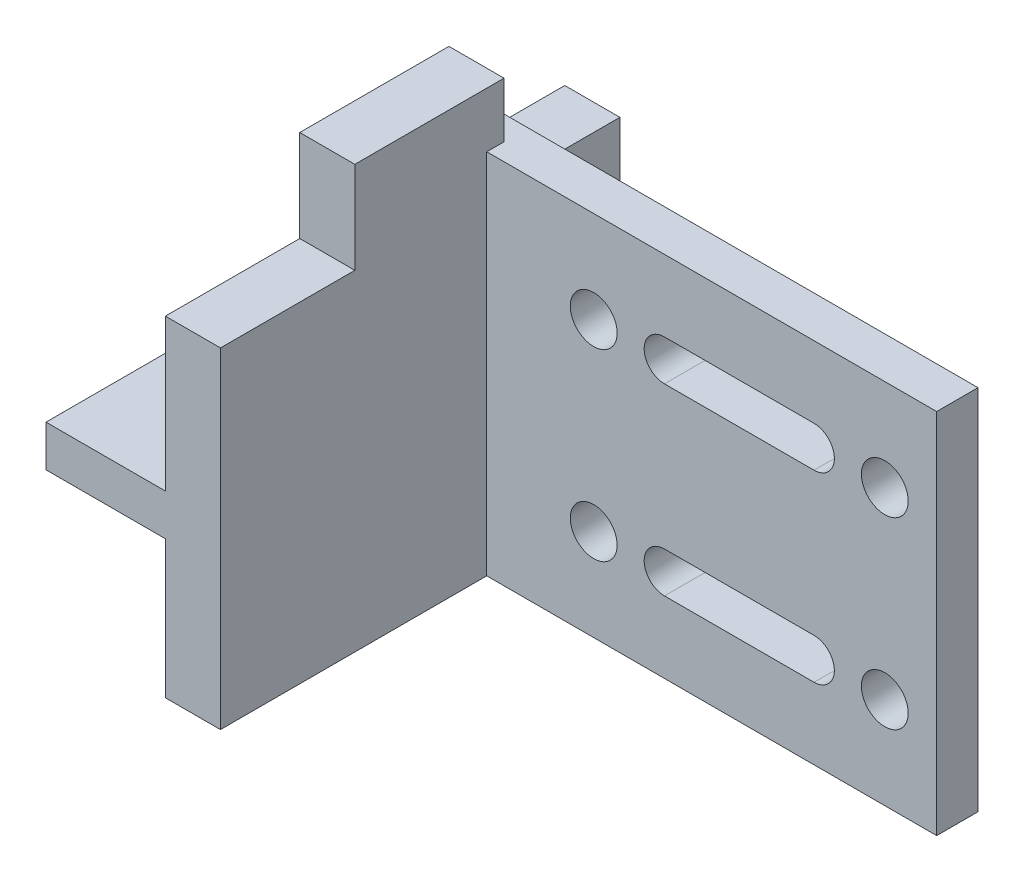
ISO-10303-21;
HEADER;
FILE_DESCRIPTION(('STEP AP214'),'2;1');
FILE_NAME('part.step','',(''),(''),'','','');
FILE_SCHEMA(('AUTOMOTIVE_DESIGN { 1 0 10303 214 1 1 1 1 }'));
ENDSEC;
DATA;
#1=APPLICATION_CONTEXT('core data for automotive mechanical design processes');
#2=APPLICATION_PROTOCOL_DEFINITION('international standard','automotive_design',2000,#1);
#3=PRODUCT_CONTEXT('',#1,'mechanical');
#4=PRODUCT('Part','Part','',(#3));
#5=PRODUCT_RELATED_PRODUCT_CATEGORY('part','',(#4));
#6=PRODUCT_DEFINITION_FORMATION('','',#4);
#7=PRODUCT_DEFINITION_CONTEXT('part definition',#1,'design');
#8=PRODUCT_DEFINITION('design','',#6,#7);
#9=PRODUCT_DEFINITION_SHAPE('','',#8);
#10=(LENGTH_UNIT() NAMED_UNIT(*) SI_UNIT(.MILLI.,.METRE.));
#11=(NAMED_UNIT(*) PLANE_ANGLE_UNIT() SI_UNIT($,.RADIAN.));
#12=(NAMED_UNIT(*) SI_UNIT($,.STERADIAN.) SOLID_ANGLE_UNIT());
#13=UNCERTAINTY_MEASURE_WITH_UNIT(LENGTH_MEASURE(1.E-05),#10,'distance_accuracy_value','');
#14=(GEOMETRIC_REPRESENTATION_CONTEXT(3) GLOBAL_UNCERTAINTY_ASSIGNED_CONTEXT((#13)) GLOBAL_UNIT_ASSIGNED_CONTEXT((#10,
#11,#12)) REPRESENTATION_CONTEXT('',''));
#15=CARTESIAN_POINT('',(0.,0.,0.));
#16=DIRECTION('',(0.,0.,1.));
#17=DIRECTION('',(1.,0.,0.));
#18=AXIS2_PLACEMENT_3D('',#15,#16,#17);
#19=CARTESIAN_POINT('',(-33.5,10.,4.5));
#20=DIRECTION('',(1.,0.,0.));
#21=DIRECTION('',(0.,0.,-1.));
#22=AXIS2_PLACEMENT_3D('',#19,#20,#21);
#23=PLANE('',#22);
#24=DIRECTION('',(0.,1.,0.));
#25=VECTOR('',#24,1.);
#26=CARTESIAN_POINT('',(-33.5,10.,-10.));
#27=LINE('',#26,#25);
#28=CARTESIAN_POINT('',(-33.5,9.5,-10.));
#29=VERTEX_POINT('',#28);
#30=CARTESIAN_POINT('',(-33.5,26.,-10.));
#31=VERTEX_POINT('',#30);
#32=EDGE_CURVE('E447',#29,#31,#27,.T.);
#33=ORIENTED_EDGE('',*,*,#32,.F.);
#34=DIRECTION('',(0.,0.,-1.));
#35=VECTOR('',#34,1.);
#36=CARTESIAN_POINT('',(-33.5,9.5,33.5));
#37=LINE('',#36,#35);
#38=CARTESIAN_POINT('',(-33.5,9.5,33.5));
#39=VERTEX_POINT('',#38);
#40=EDGE_CURVE('E458',#39,#29,#37,.T.);
#41=ORIENTED_EDGE('',*,*,#40,.F.);
#42=DIRECTION('',(0.,-1.,0.));
#43=VECTOR('',#42,1.);
#44=CARTESIAN_POINT('',(-33.5,10.,33.5));
#45=LINE('',#44,#43);
#46=CARTESIAN_POINT('',(-33.5,26.,33.5));
#47=VERTEX_POINT('',#46);
#48=EDGE_CURVE('E243',#47,#39,#45,.T.);
#49=ORIENTED_EDGE('',*,*,#48,.F.);
#50=DIRECTION('',(0.,0.,1.));
#51=VECTOR('',#50,1.);
#52=CARTESIAN_POINT('',(-33.5,26.,-10.));
#53=LINE('',#52,#51);
#54=CARTESIAN_POINT('',(-33.5,26.,18.8661616161615));
#55=VERTEX_POINT('',#54);
#56=EDGE_CURVE('E433',#55,#47,#53,.T.);
#57=ORIENTED_EDGE('',*,*,#56,.F.);
#58=DIRECTION('',(0.,-1.,0.));
#59=VECTOR('',#58,1.);
#60=CARTESIAN_POINT('',(-33.5,36.,18.8661616161615));
#61=LINE('',#60,#59);
#62=CARTESIAN_POINT('',(-33.5,36.,18.8661616161615));
#63=VERTEX_POINT('',#62);
#64=EDGE_CURVE('E427',#63,#55,#61,.T.);
#65=ORIENTED_EDGE('',*,*,#64,.F.);
#66=DIRECTION('',(0.,0.,1.));
#67=VECTOR('',#66,1.);
#68=CARTESIAN_POINT('',(-33.5,36.,2.61816440264701));
#69=LINE('',#68,#67);
#70=CARTESIAN_POINT('',(-33.5,36.,2.61816440264701));
#71=VERTEX_POINT('',#70);
#72=EDGE_CURVE('E408',#71,#63,#69,.T.);
#73=ORIENTED_EDGE('',*,*,#72,.F.);
#74=DIRECTION('',(0.,-1.,0.));
#75=VECTOR('',#74,1.);
#76=CARTESIAN_POINT('',(-33.5,36.,2.61816440264701));
#77=LINE('',#76,#75);
#78=CARTESIAN_POINT('',(-33.5,30.,2.61816440264701));
#79=VERTEX_POINT('',#78);
#80=EDGE_CURVE('E417',#71,#79,#77,.T.);
#81=ORIENTED_EDGE('',*,*,#80,.T.);
#82=DIRECTION('',(0.,0.,-1.));
#83=VECTOR('',#82,1.);
#84=CARTESIAN_POINT('',(-33.5,30.,4.5));
#85=LINE('',#84,#83);
#86=CARTESIAN_POINT('',(-33.5,30.,0.));
#87=VERTEX_POINT('',#86);
#88=EDGE_CURVE('E52',#79,#87,#85,.T.);
#89=ORIENTED_EDGE('',*,*,#88,.T.);
#90=DIRECTION('',(0.,1.,0.));
#91=VECTOR('',#90,1.);
#92=CARTESIAN_POINT('',(-33.5,10.,0.));
#93=LINE('',#92,#91);
#94=CARTESIAN_POINT('',(-33.5,26.,0.));
#95=VERTEX_POINT('',#94);
#96=EDGE_CURVE('E391',#95,#87,#93,.T.);
#97=ORIENTED_EDGE('',*,*,#96,.F.);
#98=EDGE_CURVE('E434',#31,#95,#53,.T.);
#99=ORIENTED_EDGE('',*,*,#98,.F.);
#100=EDGE_LOOP('',(#33,#41,#49,#57,#65,#73,#81,#89,#97,#99));
#101=FACE_BOUND('',#100,.T.);
#102=ADVANCED_FACE('F35',(#101),#23,.F.);
#103=CARTESIAN_POINT('',(-33.5,5.,33.5));
#104=VERTEX_POINT('',#103);
#105=CARTESIAN_POINT('',(-33.5,-10.,33.5));
#106=VERTEX_POINT('',#105);
#107=EDGE_CURVE('E226',#104,#106,#45,.T.);
#108=ORIENTED_EDGE('',*,*,#107,.F.);
#109=DIRECTION('',(0.,0.,1.));
#110=VECTOR('',#109,1.);
#111=CARTESIAN_POINT('',(-33.5,5.,0.));
#112=LINE('',#111,#110);
#113=CARTESIAN_POINT('',(-33.5,5.,-10.));
#114=VERTEX_POINT('',#113);
#115=EDGE_CURVE('E453',#114,#104,#112,.T.);
#116=ORIENTED_EDGE('',*,*,#115,.F.);
#117=CARTESIAN_POINT('',(-33.5,-10.,-10.));
#118=VERTEX_POINT('',#117);
#119=EDGE_CURVE('E228',#118,#114,#27,.T.);
#120=ORIENTED_EDGE('',*,*,#119,.F.);
#121=DIRECTION('',(0.,0.,1.));
#122=VECTOR('',#121,1.);
#123=CARTESIAN_POINT('',(-33.5,-10.,-10.));
#124=LINE('',#123,#122);
#125=EDGE_CURVE('E223',#118,#106,#124,.T.);
#126=ORIENTED_EDGE('',*,*,#125,.T.);
#127=EDGE_LOOP('',(#108,#116,#120,#126));
#128=FACE_BOUND('',#127,.T.);
#129=ADVANCED_FACE('F225',(#128),#23,.F.);
#130=CARTESIAN_POINT('',(-27.5,-10.,33.5));
#131=DIRECTION('',(-1.,0.,0.));
#132=DIRECTION('',(0.,0.,1.));
#133=AXIS2_PLACEMENT_3D('',#130,#131,#132);
#134=PLANE('',#133);
#135=DIRECTION('',(0.,1.,0.));
#136=VECTOR('',#135,1.);
#137=CARTESIAN_POINT('',(-27.5,-10.,4.5));
#138=LINE('',#137,#136);
#139=CARTESIAN_POINT('',(-27.5,-10.,4.5));
#140=VERTEX_POINT('',#139);
#141=CARTESIAN_POINT('',(-27.5,30.,4.5));
#142=VERTEX_POINT('',#141);
#143=EDGE_CURVE('E250',#140,#142,#138,.T.);
#144=ORIENTED_EDGE('',*,*,#143,.T.);
#145=DIRECTION('',(0.,0.,-1.));
#146=VECTOR('',#145,1.);
#147=CARTESIAN_POINT('',(-27.5,30.,33.5));
#148=LINE('',#147,#146);
#149=CARTESIAN_POINT('',(-27.5,30.,2.61816440264701));
#150=VERTEX_POINT('',#149);
#151=EDGE_CURVE('E403',#142,#150,#148,.T.);
#152=ORIENTED_EDGE('',*,*,#151,.T.);
#153=DIRECTION('',(0.,-1.,0.));
#154=VECTOR('',#153,1.);
#155=CARTESIAN_POINT('',(-27.5,36.,2.61816440264701));
#156=LINE('',#155,#154);
#157=CARTESIAN_POINT('',(-27.5,36.,2.61816440264701));
#158=VERTEX_POINT('',#157);
#159=EDGE_CURVE('E421',#158,#150,#156,.T.);
#160=ORIENTED_EDGE('',*,*,#159,.F.);
#161=DIRECTION('',(0.,0.,-1.));
#162=VECTOR('',#161,1.);
#163=CARTESIAN_POINT('',(-27.5,36.,2.61816440264701));
#164=LINE('',#163,#162);
#165=CARTESIAN_POINT('',(-27.5,36.,18.8661616161615));
#166=VERTEX_POINT('',#165);
#167=EDGE_CURVE('E413',#166,#158,#164,.T.);
#168=ORIENTED_EDGE('',*,*,#167,.F.);
#169=DIRECTION('',(0.,-1.,0.));
#170=VECTOR('',#169,1.);
#171=CARTESIAN_POINT('',(-27.5,36.,18.8661616161615));
#172=LINE('',#171,#170);
#173=CARTESIAN_POINT('',(-27.5,26.,18.8661616161615));
#174=VERTEX_POINT('',#173);
#175=EDGE_CURVE('E424',#166,#174,#172,.T.);
#176=ORIENTED_EDGE('',*,*,#175,.T.);
#177=DIRECTION('',(0.,0.,-1.));
#178=VECTOR('',#177,1.);
#179=CARTESIAN_POINT('',(-27.5,26.,33.5));
#180=LINE('',#179,#178);
#181=CARTESIAN_POINT('',(-27.5,26.,33.5));
#182=VERTEX_POINT('',#181);
#183=EDGE_CURVE('E440',#182,#174,#180,.T.);
#184=ORIENTED_EDGE('',*,*,#183,.F.);
#185=DIRECTION('',(0.,1.,0.));
#186=VECTOR('',#185,1.);
#187=CARTESIAN_POINT('',(-27.5,-10.,33.5));
#188=LINE('',#187,#186);
#189=CARTESIAN_POINT('',(-27.5,-10.,33.5));
#190=VERTEX_POINT('',#189);
#191=EDGE_CURVE('E244',#190,#182,#188,.T.);
#192=ORIENTED_EDGE('',*,*,#191,.F.);
#193=DIRECTION('',(0.,0.,-1.));
#194=VECTOR('',#193,1.);
#195=CARTESIAN_POINT('',(-27.5,-10.,33.5));
#196=LINE('',#195,#194);
#197=EDGE_CURVE('E249',#190,#140,#196,.T.);
#198=ORIENTED_EDGE('',*,*,#197,.T.);
#199=EDGE_LOOP('',(#144,#152,#160,#168,#176,#184,#192,#198));
#200=FACE_BOUND('',#199,.T.);
#201=ADVANCED_FACE('F526',(#200),#134,.F.);
#202=CARTESIAN_POINT('',(0.,26.,0.));
#203=DIRECTION('',(0.,1.,0.));
#204=DIRECTION('',(0.,0.,1.));
#205=AXIS2_PLACEMENT_3D('',#202,#203,#204);
#206=PLANE('',#205);
#207=DIRECTION('',(-1.,0.,0.));
#208=VECTOR('',#207,1.);
#209=CARTESIAN_POINT('',(0.,26.,0.));
#210=LINE('',#209,#208);
#211=CARTESIAN_POINT('',(-27.5,26.,0.));
#212=VERTEX_POINT('',#211);
#213=EDGE_CURVE('E406',#212,#95,#210,.T.);
#214=ORIENTED_EDGE('',*,*,#213,.F.);
#215=CARTESIAN_POINT('',(-27.5,26.,-10.));
#216=VERTEX_POINT('',#215);
#217=EDGE_CURVE('E439',#212,#216,#180,.T.);
#218=ORIENTED_EDGE('',*,*,#217,.T.);
#219=DIRECTION('',(-1.,0.,0.));
#220=VECTOR('',#219,1.);
#221=CARTESIAN_POINT('',(-27.5,26.,-10.));
#222=LINE('',#221,#220);
#223=EDGE_CURVE('E430',#216,#31,#222,.T.);
#224=ORIENTED_EDGE('',*,*,#223,.T.);
#225=ORIENTED_EDGE('',*,*,#98,.T.);
#226=EDGE_LOOP('',(#214,#218,#224,#225));
#227=FACE_BOUND('',#226,.T.);
#228=ADVANCED_FACE('F517',(#227),#206,.T.);
#229=ORIENTED_EDGE('',*,*,#217,.F.);
#230=DIRECTION('',(0.,-1.,0.));
#231=VECTOR('',#230,1.);
#232=CARTESIAN_POINT('',(-27.5,10.,0.));
#233=LINE('',#232,#231);
#234=CARTESIAN_POINT('',(-27.5,-10.,0.));
#235=VERTEX_POINT('',#234);
#236=EDGE_CURVE('E442',#212,#235,#233,.T.);
#237=ORIENTED_EDGE('',*,*,#236,.T.);
#238=DIRECTION('',(0.,0.,1.));
#239=VECTOR('',#238,1.);
#240=CARTESIAN_POINT('',(-27.5,-10.,-10.));
#241=LINE('',#240,#239);
#242=CARTESIAN_POINT('',(-27.5,-10.,-10.));
#243=VERTEX_POINT('',#242);
#244=EDGE_CURVE('E232',#243,#235,#241,.T.);
#245=ORIENTED_EDGE('',*,*,#244,.F.);
#246=DIRECTION('',(0.,-1.,0.));
#247=VECTOR('',#246,1.);
#248=CARTESIAN_POINT('',(-27.5,10.,-10.));
#249=LINE('',#248,#247);
#250=EDGE_CURVE('E443',#216,#243,#249,.T.);
#251=ORIENTED_EDGE('',*,*,#250,.F.);
#252=EDGE_LOOP('',(#229,#237,#245,#251));
#253=FACE_BOUND('',#252,.T.);
#254=ADVANCED_FACE('F566',(#253),#134,.F.);
#255=CARTESIAN_POINT('',(0.,0.,33.5));
#256=DIRECTION('',(0.,0.,1.));
#257=DIRECTION('',(1.,0.,0.));
#258=AXIS2_PLACEMENT_3D('',#255,#256,#257);
#259=PLANE('',#258);
#260=ORIENTED_EDGE('',*,*,#107,.T.);
#261=DIRECTION('',(1.,0.,0.));
#262=VECTOR('',#261,1.);
#263=CARTESIAN_POINT('',(-33.5,-10.,33.5));
#264=LINE('',#263,#262);
#265=EDGE_CURVE('E238',#106,#190,#264,.T.);
#266=ORIENTED_EDGE('',*,*,#265,.T.);
#267=ORIENTED_EDGE('',*,*,#191,.T.);
#268=DIRECTION('',(1.,0.,0.));
#269=VECTOR('',#268,1.);
#270=CARTESIAN_POINT('',(-33.5,26.,33.5));
#271=LINE('',#270,#269);
#272=EDGE_CURVE('E437',#47,#182,#271,.T.);
#273=ORIENTED_EDGE('',*,*,#272,.F.);
#274=ORIENTED_EDGE('',*,*,#48,.T.);
#275=DIRECTION('',(1.,0.,0.));
#276=VECTOR('',#275,1.);
#277=CARTESIAN_POINT('',(-46.5,9.5,33.5));
#278=LINE('',#277,#276);
#279=CARTESIAN_POINT('',(-46.5,9.5,33.5));
#280=VERTEX_POINT('',#279);
#281=EDGE_CURVE('E465',#280,#39,#278,.T.);
#282=ORIENTED_EDGE('',*,*,#281,.F.);
#283=DIRECTION('',(0.,1.,0.));
#284=VECTOR('',#283,1.);
#285=CARTESIAN_POINT('',(-46.5,5.,33.5));
#286=LINE('',#285,#284);
#287=CARTESIAN_POINT('',(-46.5,5.,33.5));
#288=VERTEX_POINT('',#287);
#289=EDGE_CURVE('E460',#288,#280,#286,.T.);
#290=ORIENTED_EDGE('',*,*,#289,.F.);
#291=DIRECTION('',(1.,0.,0.));
#292=VECTOR('',#291,1.);
#293=CARTESIAN_POINT('',(-46.5,5.,33.5));
#294=LINE('',#293,#292);
#295=EDGE_CURVE('E242',#288,#104,#294,.T.);
#296=ORIENTED_EDGE('',*,*,#295,.T.);
#297=EDGE_LOOP('',(#260,#266,#267,#273,#274,#282,#290,#296));
#298=FACE_BOUND('',#297,.T.);
#299=ADVANCED_FACE('F236',(#298),#259,.T.);
#300=CARTESIAN_POINT('',(0.,0.,-10.));
#301=DIRECTION('',(0.,0.,1.));
#302=DIRECTION('',(1.,0.,0.));
#303=AXIS2_PLACEMENT_3D('',#300,#301,#302);
#304=PLANE('',#303);
#305=ORIENTED_EDGE('',*,*,#223,.F.);
#306=ORIENTED_EDGE('',*,*,#250,.T.);
#307=DIRECTION('',(-1.,0.,0.));
#308=VECTOR('',#307,1.);
#309=CARTESIAN_POINT('',(-33.5,-10.,-10.));
#310=LINE('',#309,#308);
#311=EDGE_CURVE('E445',#243,#118,#310,.T.);
#312=ORIENTED_EDGE('',*,*,#311,.T.);
#313=ORIENTED_EDGE('',*,*,#119,.T.);
#314=DIRECTION('',(0.,1.,0.));
#315=VECTOR('',#314,1.);
#316=CARTESIAN_POINT('',(-33.5,0.,-10.));
#317=LINE('',#316,#315);
#318=EDGE_CURVE('E344',#114,#29,#317,.T.);
#319=ORIENTED_EDGE('',*,*,#318,.T.);
#320=ORIENTED_EDGE('',*,*,#32,.T.);
#321=EDGE_LOOP('',(#305,#306,#312,#313,#319,#320));
#322=FACE_BOUND('',#321,.T.);
#323=ADVANCED_FACE('F480',(#322),#304,.F.);
#324=CARTESIAN_POINT('',(0.,0.,4.5));
#325=DIRECTION('',(0.,0.,-1.));
#326=DIRECTION('',(-1.,0.,0.));
#327=AXIS2_PLACEMENT_3D('',#324,#325,#326);
#328=PLANE('',#327);
#329=CARTESIAN_POINT('',(15.85,0.,4.5));
#330=DIRECTION('',(0.,0.,1.));
#331=DIRECTION('',(1.,0.,0.));
#332=AXIS2_PLACEMENT_3D('',#329,#330,#331);
#333=CIRCLE('',#332,2.55);
#334=CARTESIAN_POINT('',(18.4,0.,4.5));
#335=VERTEX_POINT('',#334);
#336=EDGE_CURVE('E259',#335,#335,#333,.T.);
#337=ORIENTED_EDGE('',*,*,#336,.F.);
#338=EDGE_LOOP('',(#337));
#339=FACE_BOUND('',#338,.T.);
#340=CARTESIAN_POINT('',(-15.85,0.,4.5));
#341=DIRECTION('',(0.,0.,1.));
#342=DIRECTION('',(1.,0.,0.));
#343=AXIS2_PLACEMENT_3D('',#340,#341,#342);
#344=CIRCLE('',#343,2.55);
#345=CARTESIAN_POINT('',(-13.3,0.,4.5));
#346=VERTEX_POINT('',#345);
#347=EDGE_CURVE('E265',#346,#346,#344,.T.);
#348=ORIENTED_EDGE('',*,*,#347,.F.);
#349=EDGE_LOOP('',(#348));
#350=FACE_BOUND('',#349,.T.);
#351=CARTESIAN_POINT('',(-8.14470186053351,0.,4.5));
#352=DIRECTION('',(0.,0.,1.));
#353=DIRECTION('',(1.,0.,0.));
#354=AXIS2_PLACEMENT_3D('',#351,#352,#353);
#355=CIRCLE('',#354,2.21201456315769);
#356=CARTESIAN_POINT('',(-8.14470186053351,2.21201456315769,4.5));
#357=VERTEX_POINT('',#356);
#358=CARTESIAN_POINT('',(-8.14470186053351,-2.21201456315768,4.5));
#359=VERTEX_POINT('',#358);
#360=EDGE_CURVE('E271',#357,#359,#355,.T.);
#361=ORIENTED_EDGE('',*,*,#360,.F.);
#362=DIRECTION('',(-1.,0.,0.));
#363=VECTOR('',#362,1.);
#364=CARTESIAN_POINT('',(-8.14470186053351,2.21201456315769,4.5));
#365=LINE('',#364,#363);
#366=CARTESIAN_POINT('',(8.14470186053351,2.21201456315769,4.5));
#367=VERTEX_POINT('',#366);
#368=EDGE_CURVE('E279',#367,#357,#365,.T.);
#369=ORIENTED_EDGE('',*,*,#368,.F.);
#370=CARTESIAN_POINT('',(8.14470186053351,0.,4.5));
#371=DIRECTION('',(0.,0.,1.));
#372=DIRECTION('',(1.,0.,0.));
#373=AXIS2_PLACEMENT_3D('',#370,#371,#372);
#374=CIRCLE('',#373,2.21201456315769);
#375=CARTESIAN_POINT('',(8.14470186053351,-2.21201456315768,4.5));
#376=VERTEX_POINT('',#375);
#377=EDGE_CURVE('E276',#376,#367,#374,.T.);
#378=ORIENTED_EDGE('',*,*,#377,.F.);
#379=DIRECTION('',(1.,0.,0.));
#380=VECTOR('',#379,1.);
#381=CARTESIAN_POINT('',(-8.14470186053351,-2.21201456315768,4.5));
#382=LINE('',#381,#380);
#383=EDGE_CURVE('E273',#359,#376,#382,.T.);
#384=ORIENTED_EDGE('',*,*,#383,.F.);
#385=EDGE_LOOP('',(#361,#369,#378,#384));
#386=FACE_BOUND('',#385,.T.);
#387=ORIENTED_EDGE('',*,*,#143,.F.);
#388=DIRECTION('',(1.,0.,0.));
#389=VECTOR('',#388,1.);
#390=CARTESIAN_POINT('',(-33.5,-10.,4.5));
#391=LINE('',#390,#389);
#392=CARTESIAN_POINT('',(21.5,-10.,4.5));
#393=VERTEX_POINT('',#392);
#394=EDGE_CURVE('E302',#140,#393,#391,.T.);
#395=ORIENTED_EDGE('',*,*,#394,.T.);
#396=DIRECTION('',(0.,1.,0.));
#397=VECTOR('',#396,1.);
#398=CARTESIAN_POINT('',(21.5,10.,4.5));
#399=LINE('',#398,#397);
#400=CARTESIAN_POINT('',(21.5,30.,4.5));
#401=VERTEX_POINT('',#400);
#402=EDGE_CURVE('E304',#393,#401,#399,.T.);
#403=ORIENTED_EDGE('',*,*,#402,.T.);
#404=DIRECTION('',(1.,0.,0.));
#405=VECTOR('',#404,1.);
#406=CARTESIAN_POINT('',(-33.5,30.,4.5));
#407=LINE('',#406,#405);
#408=EDGE_CURVE('E392',#142,#401,#407,.T.);
#409=ORIENTED_EDGE('',*,*,#408,.F.);
#410=EDGE_LOOP('',(#387,#395,#403,#409));
#411=FACE_BOUND('',#410,.T.);
#412=CARTESIAN_POINT('',(15.85,20.,4.5));
#413=DIRECTION('',(0.,0.,-1.));
#414=DIRECTION('',(1.,0.,0.));
#415=AXIS2_PLACEMENT_3D('',#412,#413,#414);
#416=CIRCLE('',#415,2.55);
#417=CARTESIAN_POINT('',(18.4,20.,4.5));
#418=VERTEX_POINT('',#417);
#419=EDGE_CURVE('E348',#418,#418,#416,.T.);
#420=ORIENTED_EDGE('',*,*,#419,.T.);
#421=EDGE_LOOP('',(#420));
#422=FACE_BOUND('',#421,.T.);
#423=CARTESIAN_POINT('',(-15.85,20.,4.5));
#424=DIRECTION('',(0.,0.,-1.));
#425=DIRECTION('',(1.,0.,0.));
#426=AXIS2_PLACEMENT_3D('',#423,#424,#425);
#427=CIRCLE('',#426,2.55);
#428=CARTESIAN_POINT('',(-13.3,20.,4.5));
#429=VERTEX_POINT('',#428);
#430=EDGE_CURVE('E354',#429,#429,#427,.T.);
#431=ORIENTED_EDGE('',*,*,#430,.T.);
#432=EDGE_LOOP('',(#431));
#433=FACE_BOUND('',#432,.T.);
#434=DIRECTION('',(-1.,0.,0.));
#435=VECTOR('',#434,1.);
#436=CARTESIAN_POINT('',(-8.14470186053351,17.7879854368423,4.5));
#437=LINE('',#436,#435);
#438=CARTESIAN_POINT('',(8.14470186053351,17.7879854368423,4.5));
#439=VERTEX_POINT('',#438);
#440=CARTESIAN_POINT('',(-8.14470186053351,17.7879854368423,4.5));
#441=VERTEX_POINT('',#440);
#442=EDGE_CURVE('E363',#439,#441,#437,.T.);
#443=ORIENTED_EDGE('',*,*,#442,.T.);
#444=CARTESIAN_POINT('',(-8.14470186053351,20.,4.5));
#445=DIRECTION('',(0.,0.,-1.));
#446=DIRECTION('',(1.,0.,0.));
#447=AXIS2_PLACEMENT_3D('',#444,#445,#446);
#448=CIRCLE('',#447,2.21201456315769);
#449=CARTESIAN_POINT('',(-8.14470186053351,22.2120145631577,4.5));
#450=VERTEX_POINT('',#449);
#451=EDGE_CURVE('E360',#441,#450,#448,.T.);
#452=ORIENTED_EDGE('',*,*,#451,.T.);
#453=DIRECTION('',(1.,0.,0.));
#454=VECTOR('',#453,1.);
#455=CARTESIAN_POINT('',(-8.14470186053351,22.2120145631577,4.5));
#456=LINE('',#455,#454);
#457=CARTESIAN_POINT('',(8.14470186053351,22.2120145631577,4.5));
#458=VERTEX_POINT('',#457);
#459=EDGE_CURVE('E370',#450,#458,#456,.T.);
#460=ORIENTED_EDGE('',*,*,#459,.T.);
#461=CARTESIAN_POINT('',(8.14470186053351,20.,4.5));
#462=DIRECTION('',(0.,0.,-1.));
#463=DIRECTION('',(1.,0.,0.));
#464=AXIS2_PLACEMENT_3D('',#461,#462,#463);
#465=CIRCLE('',#464,2.21201456315769);
#466=EDGE_CURVE('E367',#458,#439,#465,.T.);
#467=ORIENTED_EDGE('',*,*,#466,.T.);
#468=EDGE_LOOP('',(#443,#452,#460,#467));
#469=FACE_BOUND('',#468,.T.);
#470=ADVANCED_FACE('F561',(#339,#350,#386,#411,#422,#433,#469),#328,.F.);
#471=CARTESIAN_POINT('',(0.,0.,0.));
#472=DIRECTION('',(0.,0.,-1.));
#473=DIRECTION('',(-1.,0.,0.));
#474=AXIS2_PLACEMENT_3D('',#471,#472,#473);
#475=PLANE('',#474);
#476=ORIENTED_EDGE('',*,*,#236,.F.);
#477=ORIENTED_EDGE('',*,*,#213,.T.);
#478=ORIENTED_EDGE('',*,*,#96,.T.);
#479=DIRECTION('',(1.,0.,0.));
#480=VECTOR('',#479,1.);
#481=CARTESIAN_POINT('',(-27.5,30.,0.));
#482=LINE('',#481,#480);
#483=CARTESIAN_POINT('',(21.5,30.,0.));
#484=VERTEX_POINT('',#483);
#485=EDGE_CURVE('E396',#87,#484,#482,.T.);
#486=ORIENTED_EDGE('',*,*,#485,.T.);
#487=DIRECTION('',(0.,1.,0.));
#488=VECTOR('',#487,1.);
#489=CARTESIAN_POINT('',(21.5,10.,0.));
#490=LINE('',#489,#488);
#491=CARTESIAN_POINT('',(21.5,-10.,0.));
#492=VERTEX_POINT('',#491);
#493=EDGE_CURVE('E305',#492,#484,#490,.T.);
#494=ORIENTED_EDGE('',*,*,#493,.F.);
#495=DIRECTION('',(1.,0.,0.));
#496=VECTOR('',#495,1.);
#497=CARTESIAN_POINT('',(-27.5,-10.,0.));
#498=LINE('',#497,#496);
#499=EDGE_CURVE('E301',#235,#492,#498,.T.);
#500=ORIENTED_EDGE('',*,*,#499,.F.);
#501=EDGE_LOOP('',(#476,#477,#478,#486,#494,#500));
#502=FACE_BOUND('',#501,.T.);
#503=CARTESIAN_POINT('',(-15.85,0.,0.));
#504=DIRECTION('',(0.,0.,1.));
#505=DIRECTION('',(1.,0.,0.));
#506=AXIS2_PLACEMENT_3D('',#503,#504,#505);
#507=CIRCLE('',#506,2.55);
#508=CARTESIAN_POINT('',(-13.3,0.,0.));
#509=VERTEX_POINT('',#508);
#510=EDGE_CURVE('E262',#509,#509,#507,.T.);
#511=ORIENTED_EDGE('',*,*,#510,.T.);
#512=EDGE_LOOP('',(#511));
#513=FACE_BOUND('',#512,.T.);
#514=DIRECTION('',(-1.,0.,0.));
#515=VECTOR('',#514,1.);
#516=CARTESIAN_POINT('',(-8.14470186053351,2.21201456315769,0.));
#517=LINE('',#516,#515);
#518=CARTESIAN_POINT('',(8.14470186053351,2.21201456315769,0.));
#519=VERTEX_POINT('',#518);
#520=CARTESIAN_POINT('',(-8.14470186053351,2.21201456315769,0.));
#521=VERTEX_POINT('',#520);
#522=EDGE_CURVE('E274',#519,#521,#517,.T.);
#523=ORIENTED_EDGE('',*,*,#522,.T.);
#524=CARTESIAN_POINT('',(-8.14470186053351,0.,0.));
#525=DIRECTION('',(0.,0.,1.));
#526=DIRECTION('',(1.,0.,0.));
#527=AXIS2_PLACEMENT_3D('',#524,#525,#526);
#528=CIRCLE('',#527,2.21201456315769);
#529=CARTESIAN_POINT('',(-8.14470186053351,-2.21201456315768,0.));
#530=VERTEX_POINT('',#529);
#531=EDGE_CURVE('E268',#521,#530,#528,.T.);
#532=ORIENTED_EDGE('',*,*,#531,.T.);
#533=DIRECTION('',(1.,0.,0.));
#534=VECTOR('',#533,1.);
#535=CARTESIAN_POINT('',(-8.14470186053351,-2.21201456315768,0.));
#536=LINE('',#535,#534);
#537=CARTESIAN_POINT('',(8.14470186053351,-2.21201456315768,0.));
#538=VERTEX_POINT('',#537);
#539=EDGE_CURVE('E284',#530,#538,#536,.T.);
#540=ORIENTED_EDGE('',*,*,#539,.T.);
#541=CARTESIAN_POINT('',(8.14470186053351,0.,0.));
#542=DIRECTION('',(0.,0.,1.));
#543=DIRECTION('',(1.,0.,0.));
#544=AXIS2_PLACEMENT_3D('',#541,#542,#543);
#545=CIRCLE('',#544,2.21201456315769);
#546=EDGE_CURVE('E287',#538,#519,#545,.T.);
#547=ORIENTED_EDGE('',*,*,#546,.T.);
#548=EDGE_LOOP('',(#523,#532,#540,#547));
#549=FACE_BOUND('',#548,.T.);
#550=CARTESIAN_POINT('',(15.85,0.,0.));
#551=DIRECTION('',(0.,0.,1.));
#552=DIRECTION('',(1.,0.,0.));
#553=AXIS2_PLACEMENT_3D('',#550,#551,#552);
#554=CIRCLE('',#553,2.55);
#555=CARTESIAN_POINT('',(18.4,0.,0.));
#556=VERTEX_POINT('',#555);
#557=EDGE_CURVE('E258',#556,#556,#554,.T.);
#558=ORIENTED_EDGE('',*,*,#557,.T.);
#559=EDGE_LOOP('',(#558));
#560=FACE_BOUND('',#559,.T.);
#561=CARTESIAN_POINT('',(15.85,20.,0.));
#562=DIRECTION('',(0.,0.,-1.));
#563=DIRECTION('',(1.,0.,0.));
#564=AXIS2_PLACEMENT_3D('',#561,#562,#563);
#565=CIRCLE('',#564,2.55);
#566=CARTESIAN_POINT('',(18.4,20.,0.));
#567=VERTEX_POINT('',#566);
#568=EDGE_CURVE('E347',#567,#567,#565,.T.);
#569=ORIENTED_EDGE('',*,*,#568,.F.);
#570=EDGE_LOOP('',(#569));
#571=FACE_BOUND('',#570,.T.);
#572=CARTESIAN_POINT('',(-15.85,20.,0.));
#573=DIRECTION('',(0.,0.,-1.));
#574=DIRECTION('',(1.,0.,0.));
#575=AXIS2_PLACEMENT_3D('',#572,#573,#574);
#576=CIRCLE('',#575,2.55);
#577=CARTESIAN_POINT('',(-13.3,20.,0.));
#578=VERTEX_POINT('',#577);
#579=EDGE_CURVE('E351',#578,#578,#576,.T.);
#580=ORIENTED_EDGE('',*,*,#579,.F.);
#581=EDGE_LOOP('',(#580));
#582=FACE_BOUND('',#581,.T.);
#583=CARTESIAN_POINT('',(-8.14470186053351,20.,0.));
#584=DIRECTION('',(0.,0.,-1.));
#585=DIRECTION('',(1.,0.,0.));
#586=AXIS2_PLACEMENT_3D('',#583,#584,#585);
#587=CIRCLE('',#586,2.21201456315769);
#588=CARTESIAN_POINT('',(-8.14470186053351,17.7879854368423,0.));
#589=VERTEX_POINT('',#588);
#590=CARTESIAN_POINT('',(-8.14470186053351,22.2120145631577,0.));
#591=VERTEX_POINT('',#590);
#592=EDGE_CURVE('E357',#589,#591,#587,.T.);
#593=ORIENTED_EDGE('',*,*,#592,.F.);
#594=DIRECTION('',(-1.,0.,0.));
#595=VECTOR('',#594,1.);
#596=CARTESIAN_POINT('',(-8.14470186053351,17.7879854368423,0.));
#597=LINE('',#596,#595);
#598=CARTESIAN_POINT('',(8.14470186053351,17.7879854368423,0.));
#599=VERTEX_POINT('',#598);
#600=EDGE_CURVE('E375',#599,#589,#597,.T.);
#601=ORIENTED_EDGE('',*,*,#600,.F.);
#602=CARTESIAN_POINT('',(8.14470186053351,20.,0.));
#603=DIRECTION('',(0.,0.,-1.));
#604=DIRECTION('',(1.,0.,0.));
#605=AXIS2_PLACEMENT_3D('',#602,#603,#604);
#606=CIRCLE('',#605,2.21201456315769);
#607=CARTESIAN_POINT('',(8.14470186053351,22.2120145631577,0.));
#608=VERTEX_POINT('',#607);
#609=EDGE_CURVE('E378',#608,#599,#606,.T.);
#610=ORIENTED_EDGE('',*,*,#609,.F.);
#611=DIRECTION('',(1.,0.,0.));
#612=VECTOR('',#611,1.);
#613=CARTESIAN_POINT('',(-8.14470186053351,22.2120145631577,0.));
#614=LINE('',#613,#612);
#615=EDGE_CURVE('E364',#591,#608,#614,.T.);
#616=ORIENTED_EDGE('',*,*,#615,.F.);
#617=EDGE_LOOP('',(#593,#601,#610,#616));
#618=FACE_BOUND('',#617,.T.);
#619=ADVANCED_FACE('F528',(#502,#513,#549,#560,#571,#582,#618),#475,.T.);
#620=CARTESIAN_POINT('',(-27.5,-10.,4.5));
#621=DIRECTION('',(0.,1.,0.));
#622=DIRECTION('',(-1.,0.,0.));
#623=AXIS2_PLACEMENT_3D('',#620,#621,#622);
#624=PLANE('',#623);
#625=ORIENTED_EDGE('',*,*,#265,.F.);
#626=ORIENTED_EDGE('',*,*,#125,.F.);
#627=ORIENTED_EDGE('',*,*,#311,.F.);
#628=ORIENTED_EDGE('',*,*,#244,.T.);
#629=ORIENTED_EDGE('',*,*,#499,.T.);
#630=DIRECTION('',(0.,0.,-1.));
#631=VECTOR('',#630,1.);
#632=CARTESIAN_POINT('',(21.5,-10.,4.5));
#633=LINE('',#632,#631);
#634=EDGE_CURVE('E44',#393,#492,#633,.T.);
#635=ORIENTED_EDGE('',*,*,#634,.F.);
#636=ORIENTED_EDGE('',*,*,#394,.F.);
#637=ORIENTED_EDGE('',*,*,#197,.F.);
#638=EDGE_LOOP('',(#625,#626,#627,#628,#629,#635,#636,#637));
#639=FACE_BOUND('',#638,.T.);
#640=ADVANCED_FACE('F37',(#639),#624,.F.);
#641=CARTESIAN_POINT('',(21.5,10.,4.5));
#642=DIRECTION('',(-1.,0.,0.));
#643=DIRECTION('',(0.,0.,1.));
#644=AXIS2_PLACEMENT_3D('',#641,#642,#643);
#645=PLANE('',#644);
#646=ORIENTED_EDGE('',*,*,#493,.T.);
#647=DIRECTION('',(0.,0.,-1.));
#648=VECTOR('',#647,1.);
#649=CARTESIAN_POINT('',(21.5,30.,4.5));
#650=LINE('',#649,#648);
#651=EDGE_CURVE('E395',#401,#484,#650,.T.);
#652=ORIENTED_EDGE('',*,*,#651,.F.);
#653=ORIENTED_EDGE('',*,*,#402,.F.);
#654=ORIENTED_EDGE('',*,*,#634,.T.);
#655=EDGE_LOOP('',(#646,#652,#653,#654));
#656=FACE_BOUND('',#655,.T.);
#657=ADVANCED_FACE('F530',(#656),#645,.F.);
#658=CARTESIAN_POINT('',(-8.14470186053351,0.,4.5));
#659=DIRECTION('',(0.,0.,-1.));
#660=DIRECTION('',(-1.,0.,0.));
#661=AXIS2_PLACEMENT_3D('',#658,#659,#660);
#662=CYLINDRICAL_SURFACE('',#661,2.21201456315769);
#663=ORIENTED_EDGE('',*,*,#531,.F.);
#664=DIRECTION('',(0.,0.,-1.));
#665=VECTOR('',#664,1.);
#666=CARTESIAN_POINT('',(-8.14470186053351,2.21201456315769,4.5));
#667=LINE('',#666,#665);
#668=EDGE_CURVE('E281',#357,#521,#667,.T.);
#669=ORIENTED_EDGE('',*,*,#668,.F.);
#670=ORIENTED_EDGE('',*,*,#360,.T.);
#671=DIRECTION('',(0.,0.,-1.));
#672=VECTOR('',#671,1.);
#673=CARTESIAN_POINT('',(-8.14470186053351,-2.21201456315768,4.5));
#674=LINE('',#673,#672);
#675=EDGE_CURVE('E298',#359,#530,#674,.T.);
#676=ORIENTED_EDGE('',*,*,#675,.T.);
#677=EDGE_LOOP('',(#663,#669,#670,#676));
#678=FACE_BOUND('',#677,.T.);
#679=ADVANCED_FACE('F532',(#678),#662,.F.);
#680=CARTESIAN_POINT('',(-8.14470186053351,-2.21201456315768,4.5));
#681=DIRECTION('',(0.,1.,0.));
#682=DIRECTION('',(-1.,0.,0.));
#683=AXIS2_PLACEMENT_3D('',#680,#681,#682);
#684=PLANE('',#683);
#685=ORIENTED_EDGE('',*,*,#539,.F.);
#686=ORIENTED_EDGE('',*,*,#675,.F.);
#687=ORIENTED_EDGE('',*,*,#383,.T.);
#688=DIRECTION('',(0.,0.,-1.));
#689=VECTOR('',#688,1.);
#690=CARTESIAN_POINT('',(8.14470186053351,-2.21201456315768,4.5));
#691=LINE('',#690,#689);
#692=EDGE_CURVE('E296',#376,#538,#691,.T.);
#693=ORIENTED_EDGE('',*,*,#692,.T.);
#694=EDGE_LOOP('',(#685,#686,#687,#693));
#695=FACE_BOUND('',#694,.T.);
#696=ADVANCED_FACE('F538',(#695),#684,.T.);
#697=CARTESIAN_POINT('',(8.14470186053351,0.,4.5));
#698=DIRECTION('',(0.,0.,-1.));
#699=DIRECTION('',(-1.,0.,0.));
#700=AXIS2_PLACEMENT_3D('',#697,#698,#699);
#701=CYLINDRICAL_SURFACE('',#700,2.21201456315769);
#702=ORIENTED_EDGE('',*,*,#546,.F.);
#703=ORIENTED_EDGE('',*,*,#692,.F.);
#704=ORIENTED_EDGE('',*,*,#377,.T.);
#705=DIRECTION('',(0.,0.,-1.));
#706=VECTOR('',#705,1.);
#707=CARTESIAN_POINT('',(8.14470186053351,2.21201456315769,4.5));
#708=LINE('',#707,#706);
#709=EDGE_CURVE('E294',#367,#519,#708,.T.);
#710=ORIENTED_EDGE('',*,*,#709,.T.);
#711=EDGE_LOOP('',(#702,#703,#704,#710));
#712=FACE_BOUND('',#711,.T.);
#713=ADVANCED_FACE('F599',(#712),#701,.F.);
#714=CARTESIAN_POINT('',(-8.14470186053351,2.21201456315769,4.5));
#715=DIRECTION('',(0.,-1.,0.));
#716=DIRECTION('',(1.,0.,0.));
#717=AXIS2_PLACEMENT_3D('',#714,#715,#716);
#718=PLANE('',#717);
#719=ORIENTED_EDGE('',*,*,#522,.F.);
#720=ORIENTED_EDGE('',*,*,#709,.F.);
#721=ORIENTED_EDGE('',*,*,#368,.T.);
#722=ORIENTED_EDGE('',*,*,#668,.T.);
#723=EDGE_LOOP('',(#719,#720,#721,#722));
#724=FACE_BOUND('',#723,.T.);
#725=ADVANCED_FACE('F595',(#724),#718,.T.);
#726=CARTESIAN_POINT('',(-15.85,0.,4.5));
#727=DIRECTION('',(0.,0.,-1.));
#728=DIRECTION('',(-1.,0.,0.));
#729=AXIS2_PLACEMENT_3D('',#726,#727,#728);
#730=CYLINDRICAL_SURFACE('',#729,2.55);
#731=ORIENTED_EDGE('',*,*,#347,.T.);
#732=EDGE_LOOP('',(#731));
#733=FACE_BOUND('',#732,.T.);
#734=ORIENTED_EDGE('',*,*,#510,.F.);
#735=EDGE_LOOP('',(#734));
#736=FACE_BOUND('',#735,.T.);
#737=ADVANCED_FACE('F591',(#733,#736),#730,.F.);
#738=CARTESIAN_POINT('',(15.85,0.,4.5));
#739=DIRECTION('',(0.,0.,-1.));
#740=DIRECTION('',(-1.,0.,0.));
#741=AXIS2_PLACEMENT_3D('',#738,#739,#740);
#742=CYLINDRICAL_SURFACE('',#741,2.55);
#743=ORIENTED_EDGE('',*,*,#336,.T.);
#744=EDGE_LOOP('',(#743));
#745=FACE_BOUND('',#744,.T.);
#746=ORIENTED_EDGE('',*,*,#557,.F.);
#747=EDGE_LOOP('',(#746));
#748=FACE_BOUND('',#747,.T.);
#749=ADVANCED_FACE('F588',(#745,#748),#742,.F.);
#750=CARTESIAN_POINT('',(-46.5,5.,0.));
#751=DIRECTION('',(0.,1.,0.));
#752=DIRECTION('',(0.,0.,1.));
#753=AXIS2_PLACEMENT_3D('',#750,#751,#752);
#754=PLANE('',#753);
#755=CARTESIAN_POINT('',(-39.1983629397422,5.,-7.4));
#756=DIRECTION('',(0.,-1.,0.));
#757=DIRECTION('',(0.,0.,-1.));
#758=AXIS2_PLACEMENT_3D('',#755,#756,#757);
#759=CIRCLE('',#758,1.5);
#760=CARTESIAN_POINT('',(-39.1983629397422,5.,-8.9));
#761=VERTEX_POINT('',#760);
#762=EDGE_CURVE('E958',#761,#761,#759,.T.);
#763=ORIENTED_EDGE('',*,*,#762,.F.);
#764=EDGE_LOOP('',(#763));
#765=FACE_BOUND('',#764,.T.);
#766=ORIENTED_EDGE('',*,*,#115,.T.);
#767=ORIENTED_EDGE('',*,*,#295,.F.);
#768=DIRECTION('',(0.,0.,1.));
#769=VECTOR('',#768,1.);
#770=CARTESIAN_POINT('',(-46.5,5.,0.));
#771=LINE('',#770,#769);
#772=CARTESIAN_POINT('',(-46.5,5.,0.));
#773=VERTEX_POINT('',#772);
#774=EDGE_CURVE('E457',#773,#288,#771,.T.);
#775=ORIENTED_EDGE('',*,*,#774,.F.);
#776=DIRECTION('',(1.,0.,0.));
#777=VECTOR('',#776,1.);
#778=CARTESIAN_POINT('',(-48.5,5.,0.));
#779=LINE('',#778,#777);
#780=CARTESIAN_POINT('',(-48.5,5.,0.));
#781=VERTEX_POINT('',#780);
#782=EDGE_CURVE('E334',#781,#773,#779,.T.);
#783=ORIENTED_EDGE('',*,*,#782,.F.);
#784=DIRECTION('',(0.,0.,1.));
#785=VECTOR('',#784,1.);
#786=CARTESIAN_POINT('',(-48.5,5.,0.));
#787=LINE('',#786,#785);
#788=CARTESIAN_POINT('',(-48.5,5.,-15.));
#789=VERTEX_POINT('',#788);
#790=EDGE_CURVE('E328',#789,#781,#787,.T.);
#791=ORIENTED_EDGE('',*,*,#790,.F.);
#792=DIRECTION('',(1.,0.,0.));
#793=VECTOR('',#792,1.);
#794=CARTESIAN_POINT('',(-48.5,5.,-15.));
#795=LINE('',#794,#793);
#796=CARTESIAN_POINT('',(-33.5,5.,-15.));
#797=VERTEX_POINT('',#796);
#798=EDGE_CURVE('E336',#789,#797,#795,.T.);
#799=ORIENTED_EDGE('',*,*,#798,.T.);
#800=DIRECTION('',(0.,0.,1.));
#801=VECTOR('',#800,1.);
#802=CARTESIAN_POINT('',(-33.5,5.,0.));
#803=LINE('',#802,#801);
#804=EDGE_CURVE('E325',#797,#114,#803,.T.);
#805=ORIENTED_EDGE('',*,*,#804,.T.);
#806=EDGE_LOOP('',(#766,#767,#775,#783,#791,#799,#805));
#807=FACE_BOUND('',#806,.T.);
#808=CARTESIAN_POINT('',(-39.2,5.,1.6));
#809=DIRECTION('',(0.,-1.,0.));
#810=DIRECTION('',(0.,0.,-1.));
#811=AXIS2_PLACEMENT_3D('',#808,#809,#810);
#812=CIRCLE('',#811,1.5);
#813=CARTESIAN_POINT('',(-39.2,5.,0.0999999999999964));
#814=VERTEX_POINT('',#813);
#815=EDGE_CURVE('E961',#814,#814,#812,.T.);
#816=ORIENTED_EDGE('',*,*,#815,.F.);
#817=EDGE_LOOP('',(#816));
#818=FACE_BOUND('',#817,.T.);
#819=CARTESIAN_POINT('',(-39.2,5.,10.6));
#820=DIRECTION('',(0.,-1.,0.));
#821=DIRECTION('',(0.,0.,-1.));
#822=AXIS2_PLACEMENT_3D('',#819,#820,#821);
#823=CIRCLE('',#822,1.5);
#824=CARTESIAN_POINT('',(-39.2,5.,9.1));
#825=VERTEX_POINT('',#824);
#826=EDGE_CURVE('E314',#825,#825,#823,.T.);
#827=ORIENTED_EDGE('',*,*,#826,.F.);
#828=EDGE_LOOP('',(#827));
#829=FACE_BOUND('',#828,.T.);
#830=ADVANCED_FACE('F486',(#765,#807,#818,#829),#754,.F.);
#831=CARTESIAN_POINT('',(-46.5,9.5,33.5));
#832=DIRECTION('',(0.,-1.,0.));
#833=DIRECTION('',(0.,0.,-1.));
#834=AXIS2_PLACEMENT_3D('',#831,#832,#833);
#835=PLANE('',#834);
#836=CARTESIAN_POINT('',(-39.1983629397422,9.5,-7.4));
#837=DIRECTION('',(0.,-1.,0.));
#838=DIRECTION('',(0.,0.,-1.));
#839=AXIS2_PLACEMENT_3D('',#836,#837,#838);
#840=CIRCLE('',#839,1.5);
#841=CARTESIAN_POINT('',(-39.1983629397422,9.5,-8.9));
#842=VERTEX_POINT('',#841);
#843=EDGE_CURVE('E39',#842,#842,#840,.T.);
#844=ORIENTED_EDGE('',*,*,#843,.T.);
#845=EDGE_LOOP('',(#844));
#846=FACE_BOUND('',#845,.T.);
#847=CARTESIAN_POINT('',(-39.2,9.5,10.6));
#848=DIRECTION('',(0.,-1.,0.));
#849=DIRECTION('',(0.,0.,-1.));
#850=AXIS2_PLACEMENT_3D('',#847,#848,#849);
#851=CIRCLE('',#850,1.5);
#852=CARTESIAN_POINT('',(-39.2,9.5,9.1));
#853=VERTEX_POINT('',#852);
#854=EDGE_CURVE('E313',#853,#853,#851,.T.);
#855=ORIENTED_EDGE('',*,*,#854,.T.);
#856=EDGE_LOOP('',(#855));
#857=FACE_BOUND('',#856,.T.);
#858=CARTESIAN_POINT('',(-39.2,9.5,1.6));
#859=DIRECTION('',(0.,-1.,0.));
#860=DIRECTION('',(0.,0.,-1.));
#861=AXIS2_PLACEMENT_3D('',#858,#859,#860);
#862=CIRCLE('',#861,1.5);
#863=CARTESIAN_POINT('',(-39.2,9.5,0.0999999999999964));
#864=VERTEX_POINT('',#863);
#865=EDGE_CURVE('E311',#864,#864,#862,.T.);
#866=ORIENTED_EDGE('',*,*,#865,.T.);
#867=EDGE_LOOP('',(#866));
#868=FACE_BOUND('',#867,.T.);
#869=ORIENTED_EDGE('',*,*,#40,.T.);
#870=DIRECTION('',(0.,0.,-1.));
#871=VECTOR('',#870,1.);
#872=CARTESIAN_POINT('',(-33.5,9.5,-15.));
#873=LINE('',#872,#871);
#874=CARTESIAN_POINT('',(-33.5,9.5,-15.));
#875=VERTEX_POINT('',#874);
#876=EDGE_CURVE('E316',#29,#875,#873,.T.);
#877=ORIENTED_EDGE('',*,*,#876,.T.);
#878=DIRECTION('',(1.,0.,0.));
#879=VECTOR('',#878,1.);
#880=CARTESIAN_POINT('',(-48.5,9.5,-15.));
#881=LINE('',#880,#879);
#882=CARTESIAN_POINT('',(-48.5,9.5,-15.));
#883=VERTEX_POINT('',#882);
#884=EDGE_CURVE('E339',#883,#875,#881,.T.);
#885=ORIENTED_EDGE('',*,*,#884,.F.);
#886=DIRECTION('',(0.,0.,-1.));
#887=VECTOR('',#886,1.);
#888=CARTESIAN_POINT('',(-48.5,9.5,-15.));
#889=LINE('',#888,#887);
#890=CARTESIAN_POINT('',(-48.5,9.5,0.));
#891=VERTEX_POINT('',#890);
#892=EDGE_CURVE('E495',#891,#883,#889,.T.);
#893=ORIENTED_EDGE('',*,*,#892,.F.);
#894=DIRECTION('',(1.,0.,0.));
#895=VECTOR('',#894,1.);
#896=CARTESIAN_POINT('',(-48.5,9.5,0.));
#897=LINE('',#896,#895);
#898=CARTESIAN_POINT('',(-46.5,9.5,0.));
#899=VERTEX_POINT('',#898);
#900=EDGE_CURVE('E341',#891,#899,#897,.T.);
#901=ORIENTED_EDGE('',*,*,#900,.T.);
#902=DIRECTION('',(0.,0.,-1.));
#903=VECTOR('',#902,1.);
#904=CARTESIAN_POINT('',(-46.5,9.5,33.5));
#905=LINE('',#904,#903);
#906=EDGE_CURVE('E462',#280,#899,#905,.T.);
#907=ORIENTED_EDGE('',*,*,#906,.F.);
#908=ORIENTED_EDGE('',*,*,#281,.T.);
#909=EDGE_LOOP('',(#869,#877,#885,#893,#901,#907,#908));
#910=FACE_BOUND('',#909,.T.);
#911=ADVANCED_FACE('F471',(#846,#857,#868,#910),#835,.F.);
#912=CARTESIAN_POINT('',(-46.5,0.,0.));
#913=DIRECTION('',(-1.,0.,0.));
#914=DIRECTION('',(0.,0.,1.));
#915=AXIS2_PLACEMENT_3D('',#912,#913,#914);
#916=PLANE('',#915);
#917=DIRECTION('',(0.,-1.,0.));
#918=VECTOR('',#917,1.);
#919=CARTESIAN_POINT('',(-46.5,9.5,0.));
#920=LINE('',#919,#918);
#921=EDGE_CURVE('E454',#899,#773,#920,.T.);
#922=ORIENTED_EDGE('',*,*,#921,.T.);
#923=ORIENTED_EDGE('',*,*,#774,.T.);
#924=ORIENTED_EDGE('',*,*,#289,.T.);
#925=ORIENTED_EDGE('',*,*,#906,.T.);
#926=EDGE_LOOP('',(#922,#923,#924,#925));
#927=FACE_BOUND('',#926,.T.);
#928=ADVANCED_FACE('F507',(#927),#916,.T.);
#929=DIRECTION('',(1.,0.,0.));
#930=VECTOR('',#929,1.);
#931=CARTESIAN_POINT('',(-33.5,26.,18.8661616161615));
#932=LINE('',#931,#930);
#933=EDGE_CURVE('E59',#55,#174,#932,.T.);
#934=ORIENTED_EDGE('',*,*,#933,.F.);
#935=ORIENTED_EDGE('',*,*,#56,.T.);
#936=ORIENTED_EDGE('',*,*,#272,.T.);
#937=ORIENTED_EDGE('',*,*,#183,.T.);
#938=EDGE_LOOP('',(#934,#935,#936,#937));
#939=FACE_BOUND('',#938,.T.);
#940=ADVANCED_FACE('F509',(#939),#206,.T.);
#941=CARTESIAN_POINT('',(-33.5,36.,18.8661616161615));
#942=DIRECTION('',(0.,0.,-1.));
#943=DIRECTION('',(-1.,0.,0.));
#944=AXIS2_PLACEMENT_3D('',#941,#942,#943);
#945=PLANE('',#944);
#946=ORIENTED_EDGE('',*,*,#933,.T.);
#947=ORIENTED_EDGE('',*,*,#175,.F.);
#948=DIRECTION('',(1.,0.,0.));
#949=VECTOR('',#948,1.);
#950=CARTESIAN_POINT('',(-33.5,36.,18.8661616161615));
#951=LINE('',#950,#949);
#952=EDGE_CURVE('E411',#63,#166,#951,.T.);
#953=ORIENTED_EDGE('',*,*,#952,.F.);
#954=ORIENTED_EDGE('',*,*,#64,.T.);
#955=EDGE_LOOP('',(#946,#947,#953,#954));
#956=FACE_BOUND('',#955,.T.);
#957=ADVANCED_FACE('F515',(#956),#945,.F.);
#958=CARTESIAN_POINT('',(-33.5,36.,2.61816440264701));
#959=DIRECTION('',(0.,0.,1.));
#960=DIRECTION('',(1.,0.,0.));
#961=AXIS2_PLACEMENT_3D('',#958,#959,#960);
#962=PLANE('',#961);
#963=ORIENTED_EDGE('',*,*,#159,.T.);
#964=DIRECTION('',(-1.,0.,0.));
#965=VECTOR('',#964,1.);
#966=CARTESIAN_POINT('',(-33.5,30.,2.61816440264701));
#967=LINE('',#966,#965);
#968=EDGE_CURVE('E11',#150,#79,#967,.T.);
#969=ORIENTED_EDGE('',*,*,#968,.T.);
#970=ORIENTED_EDGE('',*,*,#80,.F.);
#971=DIRECTION('',(-1.,0.,0.));
#972=VECTOR('',#971,1.);
#973=CARTESIAN_POINT('',(-33.5,36.,2.61816440264701));
#974=LINE('',#973,#972);
#975=EDGE_CURVE('E415',#158,#71,#974,.T.);
#976=ORIENTED_EDGE('',*,*,#975,.F.);
#977=EDGE_LOOP('',(#963,#969,#970,#976));
#978=FACE_BOUND('',#977,.T.);
#979=ADVANCED_FACE('F556',(#978),#962,.F.);
#980=CARTESIAN_POINT('',(0.,36.,0.));
#981=DIRECTION('',(0.,1.,0.));
#982=DIRECTION('',(0.,0.,1.));
#983=AXIS2_PLACEMENT_3D('',#980,#981,#982);
#984=PLANE('',#983);
#985=ORIENTED_EDGE('',*,*,#72,.T.);
#986=ORIENTED_EDGE('',*,*,#952,.T.);
#987=ORIENTED_EDGE('',*,*,#167,.T.);
#988=ORIENTED_EDGE('',*,*,#975,.T.);
#989=EDGE_LOOP('',(#985,#986,#987,#988));
#990=FACE_BOUND('',#989,.T.);
#991=ADVANCED_FACE('F659',(#990),#984,.T.);
#992=CARTESIAN_POINT('',(-27.5,30.,4.5));
#993=DIRECTION('',(0.,1.,0.));
#994=DIRECTION('',(-1.,0.,0.));
#995=AXIS2_PLACEMENT_3D('',#992,#993,#994);
#996=PLANE('',#995);
#997=ORIENTED_EDGE('',*,*,#151,.F.);
#998=ORIENTED_EDGE('',*,*,#408,.T.);
#999=ORIENTED_EDGE('',*,*,#651,.T.);
#1000=ORIENTED_EDGE('',*,*,#485,.F.);
#1001=ORIENTED_EDGE('',*,*,#88,.F.);
#1002=ORIENTED_EDGE('',*,*,#968,.F.);
#1003=EDGE_LOOP('',(#997,#998,#999,#1000,#1001,#1002));
#1004=FACE_BOUND('',#1003,.T.);
#1005=ADVANCED_FACE('F547',(#1004),#996,.T.);
#1006=CARTESIAN_POINT('',(-8.14470186053351,20.,4.5));
#1007=DIRECTION('',(0.,0.,-1.));
#1008=DIRECTION('',(-1.,0.,0.));
#1009=AXIS2_PLACEMENT_3D('',#1006,#1007,#1008);
#1010=CYLINDRICAL_SURFACE('',#1009,2.21201456315769);
#1011=ORIENTED_EDGE('',*,*,#592,.T.);
#1012=DIRECTION('',(0.,0.,-1.));
#1013=VECTOR('',#1012,1.);
#1014=CARTESIAN_POINT('',(-8.14470186053351,22.2120145631577,4.5));
#1015=LINE('',#1014,#1013);
#1016=EDGE_CURVE('E373',#450,#591,#1015,.T.);
#1017=ORIENTED_EDGE('',*,*,#1016,.F.);
#1018=ORIENTED_EDGE('',*,*,#451,.F.);
#1019=DIRECTION('',(0.,0.,-1.));
#1020=VECTOR('',#1019,1.);
#1021=CARTESIAN_POINT('',(-8.14470186053351,17.7879854368423,4.5));
#1022=LINE('',#1021,#1020);
#1023=EDGE_CURVE('E389',#441,#589,#1022,.T.);
#1024=ORIENTED_EDGE('',*,*,#1023,.T.);
#1025=EDGE_LOOP('',(#1011,#1017,#1018,#1024));
#1026=FACE_BOUND('',#1025,.T.);
#1027=ADVANCED_FACE('F632',(#1026),#1010,.F.);
#1028=CARTESIAN_POINT('',(-8.14470186053351,17.7879854368423,4.5));
#1029=DIRECTION('',(0.,-1.,0.));
#1030=DIRECTION('',(1.,0.,0.));
#1031=AXIS2_PLACEMENT_3D('',#1028,#1029,#1030);
#1032=PLANE('',#1031);
#1033=ORIENTED_EDGE('',*,*,#600,.T.);
#1034=ORIENTED_EDGE('',*,*,#1023,.F.);
#1035=ORIENTED_EDGE('',*,*,#442,.F.);
#1036=DIRECTION('',(0.,0.,-1.));
#1037=VECTOR('',#1036,1.);
#1038=CARTESIAN_POINT('',(8.14470186053351,17.7879854368423,4.5));
#1039=LINE('',#1038,#1037);
#1040=EDGE_CURVE('E387',#439,#599,#1039,.T.);
#1041=ORIENTED_EDGE('',*,*,#1040,.T.);
#1042=EDGE_LOOP('',(#1033,#1034,#1035,#1041));
#1043=FACE_BOUND('',#1042,.T.);
#1044=ADVANCED_FACE('F641',(#1043),#1032,.F.);
#1045=CARTESIAN_POINT('',(8.14470186053351,20.,4.5));
#1046=DIRECTION('',(0.,0.,-1.));
#1047=DIRECTION('',(-1.,0.,0.));
#1048=AXIS2_PLACEMENT_3D('',#1045,#1046,#1047);
#1049=CYLINDRICAL_SURFACE('',#1048,2.21201456315769);
#1050=ORIENTED_EDGE('',*,*,#609,.T.);
#1051=ORIENTED_EDGE('',*,*,#1040,.F.);
#1052=ORIENTED_EDGE('',*,*,#466,.F.);
#1053=DIRECTION('',(0.,0.,-1.));
#1054=VECTOR('',#1053,1.);
#1055=CARTESIAN_POINT('',(8.14470186053351,22.2120145631577,4.5));
#1056=LINE('',#1055,#1054);
#1057=EDGE_CURVE('E385',#458,#608,#1056,.T.);
#1058=ORIENTED_EDGE('',*,*,#1057,.T.);
#1059=EDGE_LOOP('',(#1050,#1051,#1052,#1058));
#1060=FACE_BOUND('',#1059,.T.);
#1061=ADVANCED_FACE('F643',(#1060),#1049,.F.);
#1062=CARTESIAN_POINT('',(-8.14470186053351,22.2120145631577,4.5));
#1063=DIRECTION('',(0.,1.,0.));
#1064=DIRECTION('',(-1.,0.,0.));
#1065=AXIS2_PLACEMENT_3D('',#1062,#1063,#1064);
#1066=PLANE('',#1065);
#1067=ORIENTED_EDGE('',*,*,#615,.T.);
#1068=ORIENTED_EDGE('',*,*,#1057,.F.);
#1069=ORIENTED_EDGE('',*,*,#459,.F.);
#1070=ORIENTED_EDGE('',*,*,#1016,.T.);
#1071=EDGE_LOOP('',(#1067,#1068,#1069,#1070));
#1072=FACE_BOUND('',#1071,.T.);
#1073=ADVANCED_FACE('F636',(#1072),#1066,.F.);
#1074=CARTESIAN_POINT('',(-15.85,20.,4.5));
#1075=DIRECTION('',(0.,0.,-1.));
#1076=DIRECTION('',(-1.,0.,0.));
#1077=AXIS2_PLACEMENT_3D('',#1074,#1075,#1076);
#1078=CYLINDRICAL_SURFACE('',#1077,2.55);
#1079=ORIENTED_EDGE('',*,*,#430,.F.);
#1080=EDGE_LOOP('',(#1079));
#1081=FACE_BOUND('',#1080,.T.);
#1082=ORIENTED_EDGE('',*,*,#579,.T.);
#1083=EDGE_LOOP('',(#1082));
#1084=FACE_BOUND('',#1083,.T.);
#1085=ADVANCED_FACE('F650',(#1081,#1084),#1078,.F.);
#1086=CARTESIAN_POINT('',(15.85,20.,4.5));
#1087=DIRECTION('',(0.,0.,-1.));
#1088=DIRECTION('',(-1.,0.,0.));
#1089=AXIS2_PLACEMENT_3D('',#1086,#1087,#1088);
#1090=CYLINDRICAL_SURFACE('',#1089,2.55);
#1091=ORIENTED_EDGE('',*,*,#419,.F.);
#1092=EDGE_LOOP('',(#1091));
#1093=FACE_BOUND('',#1092,.T.);
#1094=ORIENTED_EDGE('',*,*,#568,.T.);
#1095=EDGE_LOOP('',(#1094));
#1096=FACE_BOUND('',#1095,.T.);
#1097=ADVANCED_FACE('F832',(#1093,#1096),#1090,.F.);
#1098=CARTESIAN_POINT('',(-33.5,0.,0.));
#1099=DIRECTION('',(1.,0.,0.));
#1100=DIRECTION('',(0.,0.,-1.));
#1101=AXIS2_PLACEMENT_3D('',#1098,#1099,#1100);
#1102=PLANE('',#1101);
#1103=ORIENTED_EDGE('',*,*,#318,.F.);
#1104=ORIENTED_EDGE('',*,*,#804,.F.);
#1105=DIRECTION('',(0.,-1.,0.));
#1106=VECTOR('',#1105,1.);
#1107=CARTESIAN_POINT('',(-33.5,5.,-15.));
#1108=LINE('',#1107,#1106);
#1109=EDGE_CURVE('E319',#875,#797,#1108,.T.);
#1110=ORIENTED_EDGE('',*,*,#1109,.F.);
#1111=ORIENTED_EDGE('',*,*,#876,.F.);
#1112=EDGE_LOOP('',(#1103,#1104,#1110,#1111));
#1113=FACE_BOUND('',#1112,.T.);
#1114=ADVANCED_FACE('F483',(#1113),#1102,.T.);
#1115=CARTESIAN_POINT('',(-48.5,9.5,0.));
#1116=DIRECTION('',(0.,0.,-1.));
#1117=DIRECTION('',(0.,1.,0.));
#1118=AXIS2_PLACEMENT_3D('',#1115,#1116,#1117);
#1119=PLANE('',#1118);
#1120=ORIENTED_EDGE('',*,*,#921,.F.);
#1121=ORIENTED_EDGE('',*,*,#900,.F.);
#1122=DIRECTION('',(0.,1.,0.));
#1123=VECTOR('',#1122,1.);
#1124=CARTESIAN_POINT('',(-48.5,9.5,0.));
#1125=LINE('',#1124,#1123);
#1126=EDGE_CURVE('E333',#781,#891,#1125,.T.);
#1127=ORIENTED_EDGE('',*,*,#1126,.F.);
#1128=ORIENTED_EDGE('',*,*,#782,.T.);
#1129=EDGE_LOOP('',(#1120,#1121,#1127,#1128));
#1130=FACE_BOUND('',#1129,.T.);
#1131=ADVANCED_FACE('F504',(#1130),#1119,.F.);
#1132=CARTESIAN_POINT('',(-48.5,5.,-15.));
#1133=DIRECTION('',(0.,0.,1.));
#1134=DIRECTION('',(1.,0.,0.));
#1135=AXIS2_PLACEMENT_3D('',#1132,#1133,#1134);
#1136=PLANE('',#1135);
#1137=ORIENTED_EDGE('',*,*,#1109,.T.);
#1138=ORIENTED_EDGE('',*,*,#798,.F.);
#1139=DIRECTION('',(0.,-1.,0.));
#1140=VECTOR('',#1139,1.);
#1141=CARTESIAN_POINT('',(-48.5,5.,-15.));
#1142=LINE('',#1141,#1140);
#1143=EDGE_CURVE('E494',#883,#789,#1142,.T.);
#1144=ORIENTED_EDGE('',*,*,#1143,.F.);
#1145=ORIENTED_EDGE('',*,*,#884,.T.);
#1146=EDGE_LOOP('',(#1137,#1138,#1144,#1145));
#1147=FACE_BOUND('',#1146,.T.);
#1148=ADVANCED_FACE('F493',(#1147),#1136,.F.);
#1149=CARTESIAN_POINT('',(-48.5,0.,0.));
#1150=DIRECTION('',(1.,0.,0.));
#1151=DIRECTION('',(0.,0.,-1.));
#1152=AXIS2_PLACEMENT_3D('',#1149,#1150,#1151);
#1153=PLANE('',#1152);
#1154=ORIENTED_EDGE('',*,*,#1126,.T.);
#1155=ORIENTED_EDGE('',*,*,#892,.T.);
#1156=ORIENTED_EDGE('',*,*,#1143,.T.);
#1157=ORIENTED_EDGE('',*,*,#790,.T.);
#1158=EDGE_LOOP('',(#1154,#1155,#1156,#1157));
#1159=FACE_BOUND('',#1158,.T.);
#1160=ADVANCED_FACE('F501',(#1159),#1153,.F.);
#1161=CARTESIAN_POINT('',(-39.2,20.,1.6));
#1162=DIRECTION('',(0.,-1.,0.));
#1163=DIRECTION('',(0.,0.,-1.));
#1164=AXIS2_PLACEMENT_3D('',#1161,#1162,#1163);
#1165=CYLINDRICAL_SURFACE('',#1164,1.5);
#1166=ORIENTED_EDGE('',*,*,#815,.T.);
#1167=EDGE_LOOP('',(#1166));
#1168=FACE_BOUND('',#1167,.T.);
#1169=ORIENTED_EDGE('',*,*,#865,.F.);
#1170=EDGE_LOOP('',(#1169));
#1171=FACE_BOUND('',#1170,.T.);
#1172=ADVANCED_FACE('F893',(#1168,#1171),#1165,.F.);
#1173=CARTESIAN_POINT('',(-39.2,20.,10.6));
#1174=DIRECTION('',(0.,-1.,0.));
#1175=DIRECTION('',(0.,0.,-1.));
#1176=AXIS2_PLACEMENT_3D('',#1173,#1174,#1175);
#1177=CYLINDRICAL_SURFACE('',#1176,1.5);
#1178=ORIENTED_EDGE('',*,*,#826,.T.);
#1179=EDGE_LOOP('',(#1178));
#1180=FACE_BOUND('',#1179,.T.);
#1181=ORIENTED_EDGE('',*,*,#854,.F.);
#1182=EDGE_LOOP('',(#1181));
#1183=FACE_BOUND('',#1182,.T.);
#1184=ADVANCED_FACE('F902',(#1180,#1183),#1177,.F.);
#1185=CARTESIAN_POINT('',(-39.1983629397422,20.,-7.4));
#1186=DIRECTION('',(0.,-1.,0.));
#1187=DIRECTION('',(0.,0.,-1.));
#1188=AXIS2_PLACEMENT_3D('',#1185,#1186,#1187);
#1189=CYLINDRICAL_SURFACE('',#1188,1.5);
#1190=ORIENTED_EDGE('',*,*,#762,.T.);
#1191=EDGE_LOOP('',(#1190));
#1192=FACE_BOUND('',#1191,.T.);
#1193=ORIENTED_EDGE('',*,*,#843,.F.);
#1194=EDGE_LOOP('',(#1193));
#1195=FACE_BOUND('',#1194,.T.);
#1196=ADVANCED_FACE('F912',(#1192,#1195),#1189,.F.);
#1197=CLOSED_SHELL('',(#102,#129,#201,#228,#254,#299,#323,#470,#619,#640,#657,#679,#696,#713,
#725,#737,#749,#830,#911,#928,#940,#957,#979,#991,#1005,#1027,#1044,#1061,#1073,#1085,#1097,
#1114,#1131,#1148,#1160,#1172,#1184,#1196));
#1198=MANIFOLD_SOLID_BREP('B2',#1197);
#1199=ADVANCED_BREP_SHAPE_REPRESENTATION('',(#18,#1198),#14);
#1200=SHAPE_DEFINITION_REPRESENTATION(#9,#1199);
ENDSEC;
END-ISO-10303-21;
